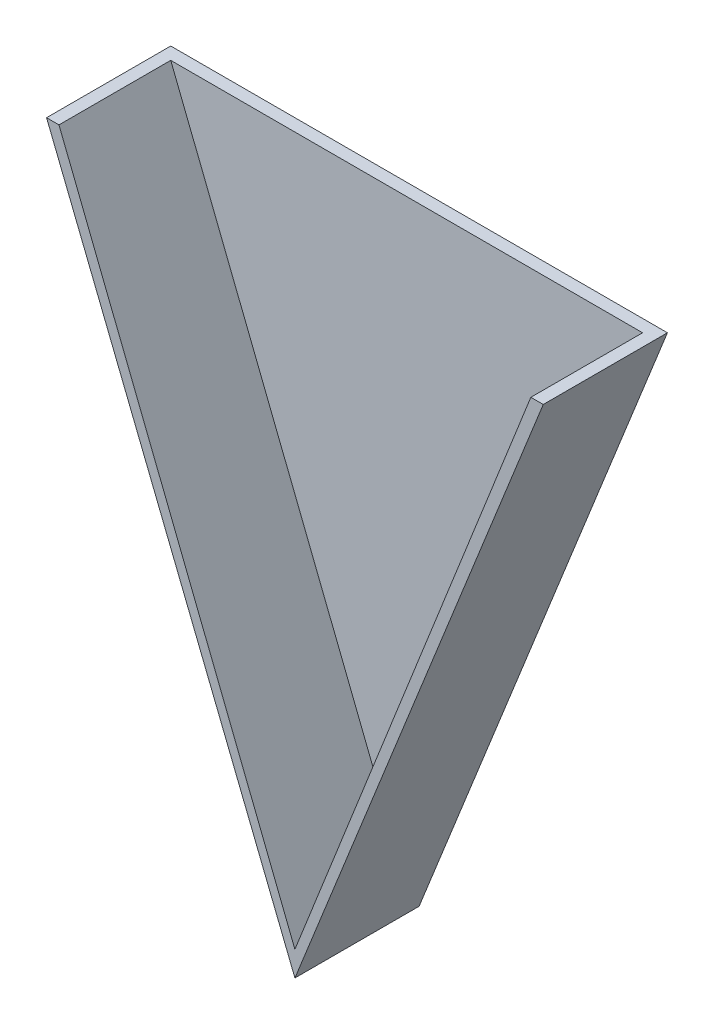
ISO-10303-21;
HEADER;
FILE_DESCRIPTION(('STEP AP214'),'2;1');
FILE_NAME('part.step','',(''),(''),'','','');
FILE_SCHEMA(('AUTOMOTIVE_DESIGN { 1 0 10303 214 1 1 1 1 }'));
ENDSEC;
DATA;
#1=APPLICATION_CONTEXT('core data for automotive mechanical design processes');
#2=APPLICATION_PROTOCOL_DEFINITION('international standard','automotive_design',2000,#1);
#3=PRODUCT_CONTEXT('',#1,'mechanical');
#4=PRODUCT('Part','Part','',(#3));
#5=PRODUCT_RELATED_PRODUCT_CATEGORY('part','',(#4));
#6=PRODUCT_DEFINITION_FORMATION('','',#4);
#7=PRODUCT_DEFINITION_CONTEXT('part definition',#1,'design');
#8=PRODUCT_DEFINITION('design','',#6,#7);
#9=PRODUCT_DEFINITION_SHAPE('','',#8);
#10=(LENGTH_UNIT() NAMED_UNIT(*) SI_UNIT(.MILLI.,.METRE.));
#11=(NAMED_UNIT(*) PLANE_ANGLE_UNIT() SI_UNIT($,.RADIAN.));
#12=(NAMED_UNIT(*) SI_UNIT($,.STERADIAN.) SOLID_ANGLE_UNIT());
#13=UNCERTAINTY_MEASURE_WITH_UNIT(LENGTH_MEASURE(1.E-05),#10,'distance_accuracy_value','');
#14=(GEOMETRIC_REPRESENTATION_CONTEXT(3) GLOBAL_UNCERTAINTY_ASSIGNED_CONTEXT((#13)) GLOBAL_UNIT_ASSIGNED_CONTEXT((#10,
#11,#12)) REPRESENTATION_CONTEXT('',''));
#15=CARTESIAN_POINT('',(0.,0.,0.));
#16=DIRECTION('',(0.,0.,1.));
#17=DIRECTION('',(1.,0.,0.));
#18=AXIS2_PLACEMENT_3D('',#15,#16,#17);
#19=CARTESIAN_POINT('',(0.508,0.,-0.254));
#20=DIRECTION('',(0.,1.,0.));
#21=DIRECTION('',(0.,0.,1.));
#22=AXIS2_PLACEMENT_3D('',#19,#20,#21);
#23=PLANE('',#22);
#24=DIRECTION('',(-1.,0.,0.));
#25=VECTOR('',#24,1.);
#26=CARTESIAN_POINT('',(0.508,0.,0.));
#27=LINE('',#26,#25);
#28=CARTESIAN_POINT('',(-0.4826,0.,0.));
#29=VERTEX_POINT('',#28);
#30=CARTESIAN_POINT('',(-0.508,0.,0.));
#31=VERTEX_POINT('',#30);
#32=EDGE_CURVE('E109',#29,#31,#27,.T.);
#33=ORIENTED_EDGE('',*,*,#32,.F.);
#34=DIRECTION('',(0.,0.,-1.));
#35=VECTOR('',#34,1.);
#36=CARTESIAN_POINT('',(-0.4826,0.,0.0508));
#37=LINE('',#36,#35);
#38=CARTESIAN_POINT('',(-0.4826,0.,-0.2286));
#39=VERTEX_POINT('',#38);
#40=EDGE_CURVE('E98',#29,#39,#37,.T.);
#41=ORIENTED_EDGE('',*,*,#40,.T.);
#42=DIRECTION('',(-1.,0.,0.));
#43=VECTOR('',#42,1.);
#44=CARTESIAN_POINT('',(0.4826,0.,-0.2286));
#45=LINE('',#44,#43);
#46=CARTESIAN_POINT('',(0.4826,0.,-0.2286));
#47=VERTEX_POINT('',#46);
#48=EDGE_CURVE('E102',#47,#39,#45,.T.);
#49=ORIENTED_EDGE('',*,*,#48,.F.);
#50=DIRECTION('',(0.,0.,-1.));
#51=VECTOR('',#50,1.);
#52=CARTESIAN_POINT('',(0.4826,0.,0.0508));
#53=LINE('',#52,#51);
#54=CARTESIAN_POINT('',(0.4826,0.,0.));
#55=VERTEX_POINT('',#54);
#56=EDGE_CURVE('E113',#55,#47,#53,.T.);
#57=ORIENTED_EDGE('',*,*,#56,.F.);
#58=CARTESIAN_POINT('',(0.508,0.,0.));
#59=VERTEX_POINT('',#58);
#60=EDGE_CURVE('E111',#59,#55,#27,.T.);
#61=ORIENTED_EDGE('',*,*,#60,.F.);
#62=DIRECTION('',(0.,0.,1.));
#63=VECTOR('',#62,1.);
#64=CARTESIAN_POINT('',(0.508,0.,-0.254));
#65=LINE('',#64,#63);
#66=CARTESIAN_POINT('',(0.508,0.,-0.254));
#67=VERTEX_POINT('',#66);
#68=EDGE_CURVE('E56',#67,#59,#65,.T.);
#69=ORIENTED_EDGE('',*,*,#68,.F.);
#70=DIRECTION('',(-1.,0.,0.));
#71=VECTOR('',#70,1.);
#72=CARTESIAN_POINT('',(0.508,0.,-0.254));
#73=LINE('',#72,#71);
#74=CARTESIAN_POINT('',(-0.508,0.,-0.254));
#75=VERTEX_POINT('',#74);
#76=EDGE_CURVE('E117',#67,#75,#73,.T.);
#77=ORIENTED_EDGE('',*,*,#76,.T.);
#78=DIRECTION('',(0.,0.,1.));
#79=VECTOR('',#78,1.);
#80=CARTESIAN_POINT('',(-0.508,0.,-0.254));
#81=LINE('',#80,#79);
#82=EDGE_CURVE('E78',#75,#31,#81,.T.);
#83=ORIENTED_EDGE('',*,*,#82,.T.);
#84=EDGE_LOOP('',(#33,#41,#49,#57,#61,#69,#77,#83));
#85=FACE_BOUND('',#84,.T.);
#86=ADVANCED_FACE('F33',(#85),#23,.T.);
#87=CARTESIAN_POINT('',(0.,0.,0.));
#88=DIRECTION('',(0.,0.,1.));
#89=DIRECTION('',(1.,0.,0.));
#90=AXIS2_PLACEMENT_3D('',#87,#88,#89);
#91=PLANE('',#90);
#92=DIRECTION('',(-0.368048451007378,-0.929806613071272,0.));
#93=VECTOR('',#92,1.);
#94=CARTESIAN_POINT('',(0.417227166979362,-0.165152420262664,0.));
#95=LINE('',#94,#93);
#96=CARTESIAN_POINT('',(0.,-1.2192,0.));
#97=VERTEX_POINT('',#96);
#98=EDGE_CURVE('E40',#55,#97,#95,.T.);
#99=ORIENTED_EDGE('',*,*,#98,.T.);
#100=DIRECTION('',(-0.368048451007378,0.929806613071272,0.));
#101=VECTOR('',#100,1.);
#102=CARTESIAN_POINT('',(-0.417227166979362,-0.165152420262664,0.));
#103=LINE('',#102,#101);
#104=EDGE_CURVE('E11',#97,#29,#103,.T.);
#105=ORIENTED_EDGE('',*,*,#104,.T.);
#106=ORIENTED_EDGE('',*,*,#32,.T.);
#107=DIRECTION('',(0.371390676354104,-0.928476690885259,0.));
#108=VECTOR('',#107,1.);
#109=CARTESIAN_POINT('',(-0.508,0.,0.));
#110=LINE('',#109,#108);
#111=CARTESIAN_POINT('',(0.,-1.27,0.));
#112=VERTEX_POINT('',#111);
#113=EDGE_CURVE('E125',#31,#112,#110,.T.);
#114=ORIENTED_EDGE('',*,*,#113,.T.);
#115=DIRECTION('',(0.371390676354104,0.928476690885259,0.));
#116=VECTOR('',#115,1.);
#117=CARTESIAN_POINT('',(0.,-1.27,0.));
#118=LINE('',#117,#116);
#119=EDGE_CURVE('E120',#112,#59,#118,.T.);
#120=ORIENTED_EDGE('',*,*,#119,.T.);
#121=ORIENTED_EDGE('',*,*,#60,.T.);
#122=EDGE_LOOP('',(#99,#105,#106,#114,#120,#121));
#123=FACE_BOUND('',#122,.T.);
#124=ADVANCED_FACE('F135',(#123),#91,.T.);
#125=CARTESIAN_POINT('',(0.,-1.27,-0.254));
#126=DIRECTION('',(0.928476690885259,-0.371390676354104,0.));
#127=DIRECTION('',(0.371390676354104,0.928476690885259,0.));
#128=AXIS2_PLACEMENT_3D('',#125,#126,#127);
#129=PLANE('',#128);
#130=ORIENTED_EDGE('',*,*,#119,.F.);
#131=DIRECTION('',(0.,0.,1.));
#132=VECTOR('',#131,1.);
#133=CARTESIAN_POINT('',(0.,-1.27,-0.254));
#134=LINE('',#133,#132);
#135=CARTESIAN_POINT('',(0.,-1.27,-0.254));
#136=VERTEX_POINT('',#135);
#137=EDGE_CURVE('E131',#136,#112,#134,.T.);
#138=ORIENTED_EDGE('',*,*,#137,.F.);
#139=DIRECTION('',(0.371390676354104,0.928476690885259,0.));
#140=VECTOR('',#139,1.);
#141=CARTESIAN_POINT('',(0.,-1.27,-0.254));
#142=LINE('',#141,#140);
#143=EDGE_CURVE('E122',#136,#67,#142,.T.);
#144=ORIENTED_EDGE('',*,*,#143,.T.);
#145=ORIENTED_EDGE('',*,*,#68,.T.);
#146=EDGE_LOOP('',(#130,#138,#144,#145));
#147=FACE_BOUND('',#146,.T.);
#148=ADVANCED_FACE('F138',(#147),#129,.T.);
#149=CARTESIAN_POINT('',(-0.508,0.,-0.254));
#150=DIRECTION('',(-0.928476690885259,-0.371390676354104,0.));
#151=DIRECTION('',(0.371390676354104,-0.928476690885259,0.));
#152=AXIS2_PLACEMENT_3D('',#149,#150,#151);
#153=PLANE('',#152);
#154=ORIENTED_EDGE('',*,*,#113,.F.);
#155=ORIENTED_EDGE('',*,*,#82,.F.);
#156=DIRECTION('',(0.371390676354104,-0.928476690885259,0.));
#157=VECTOR('',#156,1.);
#158=CARTESIAN_POINT('',(-0.508,0.,-0.254));
#159=LINE('',#158,#157);
#160=EDGE_CURVE('E119',#75,#136,#159,.T.);
#161=ORIENTED_EDGE('',*,*,#160,.T.);
#162=ORIENTED_EDGE('',*,*,#137,.T.);
#163=EDGE_LOOP('',(#154,#155,#161,#162));
#164=FACE_BOUND('',#163,.T.);
#165=ADVANCED_FACE('F140',(#164),#153,.T.);
#166=CARTESIAN_POINT('',(0.,0.,-0.254));
#167=DIRECTION('',(0.,0.,1.));
#168=DIRECTION('',(1.,0.,0.));
#169=AXIS2_PLACEMENT_3D('',#166,#167,#168);
#170=PLANE('',#169);
#171=ORIENTED_EDGE('',*,*,#76,.F.);
#172=ORIENTED_EDGE('',*,*,#143,.F.);
#173=ORIENTED_EDGE('',*,*,#160,.F.);
#174=EDGE_LOOP('',(#171,#172,#173));
#175=FACE_BOUND('',#174,.T.);
#176=ADVANCED_FACE('F142',(#175),#170,.F.);
#177=CARTESIAN_POINT('',(-0.4826,0.,0.0508));
#178=DIRECTION('',(0.929806613071272,0.368048451007378,0.));
#179=DIRECTION('',(-0.368048451007378,0.929806613071272,0.));
#180=AXIS2_PLACEMENT_3D('',#177,#178,#179);
#181=PLANE('',#180);
#182=DIRECTION('',(0.,0.,-1.));
#183=VECTOR('',#182,1.);
#184=CARTESIAN_POINT('',(0.,-1.2192,0.0508));
#185=LINE('',#184,#183);
#186=CARTESIAN_POINT('',(0.,-1.2192,-0.2286));
#187=VERTEX_POINT('',#186);
#188=EDGE_CURVE('E47',#97,#187,#185,.T.);
#189=ORIENTED_EDGE('',*,*,#188,.T.);
#190=DIRECTION('',(0.368048451007378,-0.929806613071272,0.));
#191=VECTOR('',#190,1.);
#192=CARTESIAN_POINT('',(-0.4826,0.,-0.2286));
#193=LINE('',#192,#191);
#194=EDGE_CURVE('E94',#39,#187,#193,.T.);
#195=ORIENTED_EDGE('',*,*,#194,.F.);
#196=ORIENTED_EDGE('',*,*,#40,.F.);
#197=ORIENTED_EDGE('',*,*,#104,.F.);
#198=EDGE_LOOP('',(#189,#195,#196,#197));
#199=FACE_BOUND('',#198,.T.);
#200=ADVANCED_FACE('F96',(#199),#181,.T.);
#201=CARTESIAN_POINT('',(0.,-1.2192,0.0508));
#202=DIRECTION('',(-0.929806613071272,0.368048451007378,0.));
#203=DIRECTION('',(-0.368048451007378,-0.929806613071272,0.));
#204=AXIS2_PLACEMENT_3D('',#201,#202,#203);
#205=PLANE('',#204);
#206=ORIENTED_EDGE('',*,*,#56,.T.);
#207=DIRECTION('',(0.368048451007378,0.929806613071272,0.));
#208=VECTOR('',#207,1.);
#209=CARTESIAN_POINT('',(0.,-1.2192,-0.2286));
#210=LINE('',#209,#208);
#211=EDGE_CURVE('E101',#187,#47,#210,.T.);
#212=ORIENTED_EDGE('',*,*,#211,.F.);
#213=ORIENTED_EDGE('',*,*,#188,.F.);
#214=ORIENTED_EDGE('',*,*,#98,.F.);
#215=EDGE_LOOP('',(#206,#212,#213,#214));
#216=FACE_BOUND('',#215,.T.);
#217=ADVANCED_FACE('F136',(#216),#205,.T.);
#218=CARTESIAN_POINT('',(0.,0.,-0.2286));
#219=DIRECTION('',(0.,0.,1.));
#220=DIRECTION('',(1.,0.,0.));
#221=AXIS2_PLACEMENT_3D('',#218,#219,#220);
#222=PLANE('',#221);
#223=ORIENTED_EDGE('',*,*,#48,.T.);
#224=ORIENTED_EDGE('',*,*,#194,.T.);
#225=ORIENTED_EDGE('',*,*,#211,.T.);
#226=EDGE_LOOP('',(#223,#224,#225));
#227=FACE_BOUND('',#226,.T.);
#228=ADVANCED_FACE('F105',(#227),#222,.T.);
#229=CLOSED_SHELL('',(#86,#124,#148,#165,#176,#200,#217,#228));
#230=MANIFOLD_SOLID_BREP('B2',#229);
#231=ADVANCED_BREP_SHAPE_REPRESENTATION('',(#18,#230),#14);
#232=SHAPE_DEFINITION_REPRESENTATION(#9,#231);
ENDSEC;
END-ISO-10303-21;
